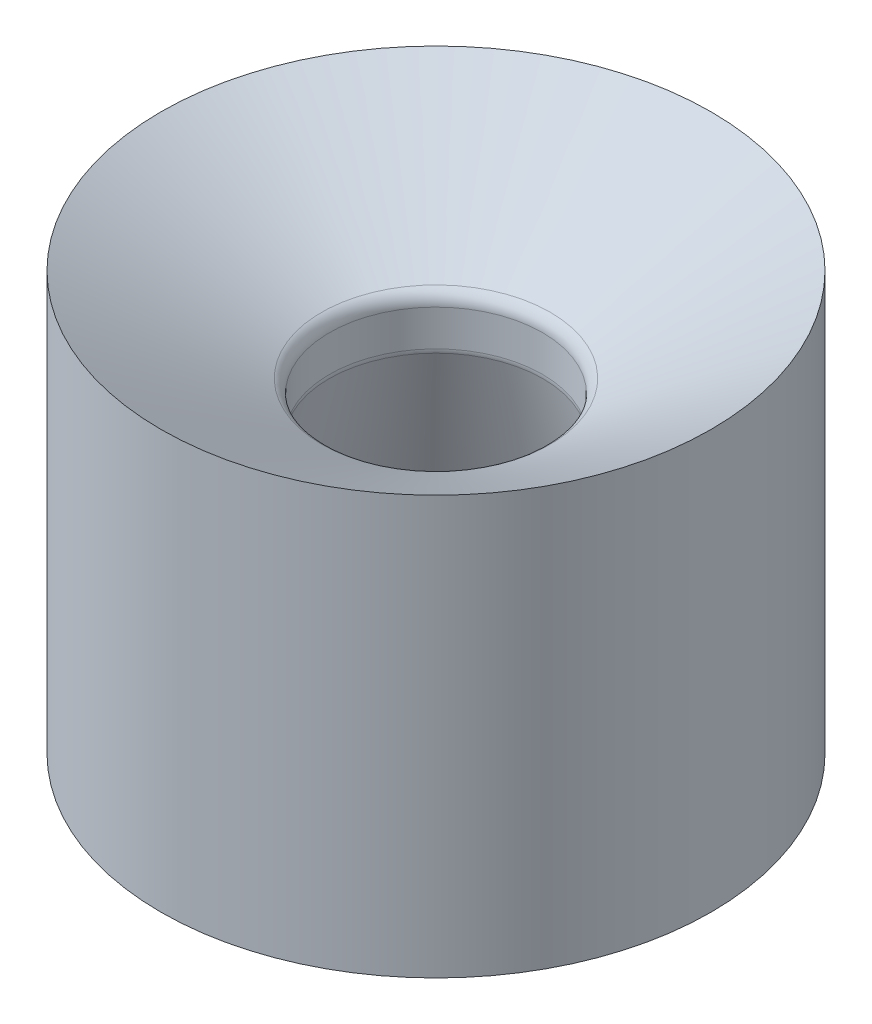
ISO-10303-21;
HEADER;
FILE_DESCRIPTION(('STEP AP214'),'2;1');
FILE_NAME('part.step','',(''),(''),'','','');
FILE_SCHEMA(('AUTOMOTIVE_DESIGN { 1 0 10303 214 1 1 1 1 }'));
ENDSEC;
DATA;
#1=APPLICATION_CONTEXT('core data for automotive mechanical design processes');
#2=APPLICATION_PROTOCOL_DEFINITION('international standard','automotive_design',2000,#1);
#3=PRODUCT_CONTEXT('',#1,'mechanical');
#4=PRODUCT('Part','Part','',(#3));
#5=PRODUCT_RELATED_PRODUCT_CATEGORY('part','',(#4));
#6=PRODUCT_DEFINITION_FORMATION('','',#4);
#7=PRODUCT_DEFINITION_CONTEXT('part definition',#1,'design');
#8=PRODUCT_DEFINITION('design','',#6,#7);
#9=PRODUCT_DEFINITION_SHAPE('','',#8);
#10=(LENGTH_UNIT() NAMED_UNIT(*) SI_UNIT(.MILLI.,.METRE.));
#11=(NAMED_UNIT(*) PLANE_ANGLE_UNIT() SI_UNIT($,.RADIAN.));
#12=(NAMED_UNIT(*) SI_UNIT($,.STERADIAN.) SOLID_ANGLE_UNIT());
#13=UNCERTAINTY_MEASURE_WITH_UNIT(LENGTH_MEASURE(1.E-05),#10,'distance_accuracy_value','');
#14=(GEOMETRIC_REPRESENTATION_CONTEXT(3) GLOBAL_UNCERTAINTY_ASSIGNED_CONTEXT((#13)) GLOBAL_UNIT_ASSIGNED_CONTEXT((#10,
#11,#12)) REPRESENTATION_CONTEXT('',''));
#15=CARTESIAN_POINT('',(0.,0.,0.));
#16=DIRECTION('',(0.,0.,1.));
#17=DIRECTION('',(1.,0.,0.));
#18=AXIS2_PLACEMENT_3D('',#15,#16,#17);
#19=CARTESIAN_POINT('',(0.,86.106,0.));
#20=DIRECTION('',(0.,-1.,0.));
#21=DIRECTION('',(0.,0.,-1.));
#22=AXIS2_PLACEMENT_3D('',#19,#20,#21);
#23=CYLINDRICAL_SURFACE('',#22,44.2849);
#24=CARTESIAN_POINT('',(0.,86.106,0.));
#25=DIRECTION('',(0.,1.,0.));
#26=DIRECTION('',(0.,0.,1.));
#27=AXIS2_PLACEMENT_3D('',#24,#25,#26);
#28=CIRCLE('',#27,44.2849);
#29=CARTESIAN_POINT('',(0.,86.106,44.2849));
#30=VERTEX_POINT('',#29);
#31=EDGE_CURVE('E63',#30,#30,#28,.T.);
#32=ORIENTED_EDGE('',*,*,#31,.F.);
#33=EDGE_LOOP('',(#32));
#34=FACE_BOUND('',#33,.T.);
#35=CARTESIAN_POINT('',(0.,18.796,0.));
#36=DIRECTION('',(0.,1.,0.));
#37=DIRECTION('',(0.,0.,1.));
#38=AXIS2_PLACEMENT_3D('',#35,#36,#37);
#39=CIRCLE('',#38,44.2849);
#40=CARTESIAN_POINT('',(0.,18.796,44.2849));
#41=VERTEX_POINT('',#40);
#42=EDGE_CURVE('E46',#41,#41,#39,.T.);
#43=ORIENTED_EDGE('',*,*,#42,.T.);
#44=EDGE_LOOP('',(#43));
#45=FACE_BOUND('',#44,.T.);
#46=ADVANCED_FACE('F42',(#34,#45),#23,.T.);
#47=CARTESIAN_POINT('',(0.,18.796,0.));
#48=DIRECTION('',(0.,1.,0.));
#49=DIRECTION('',(0.,0.,1.));
#50=AXIS2_PLACEMENT_3D('',#47,#48,#49);
#51=PLANE('',#50);
#52=CARTESIAN_POINT('',(0.,18.796,0.));
#53=DIRECTION('',(0.,1.,0.));
#54=DIRECTION('',(0.,0.,1.));
#55=AXIS2_PLACEMENT_3D('',#52,#53,#54);
#56=CIRCLE('',#55,28.9192234138084);
#57=CARTESIAN_POINT('',(0.,18.796,28.9192234138084));
#58=VERTEX_POINT('',#57);
#59=EDGE_CURVE('E60',#58,#58,#56,.T.);
#60=ORIENTED_EDGE('',*,*,#59,.T.);
#61=EDGE_LOOP('',(#60));
#62=FACE_BOUND('',#61,.T.);
#63=ORIENTED_EDGE('',*,*,#42,.F.);
#64=EDGE_LOOP('',(#63));
#65=FACE_BOUND('',#64,.T.);
#66=ADVANCED_FACE('F44',(#62,#65),#51,.F.);
#67=CARTESIAN_POINT('',(0.,70.358,0.));
#68=DIRECTION('',(0.,1.,0.));
#69=DIRECTION('',(0.,0.,1.));
#70=AXIS2_PLACEMENT_3D('',#67,#68,#69);
#71=CONICAL_SURFACE('',#70,17.145,1.04502347085495);
#72=CARTESIAN_POINT('',(0.,71.0921476985496,0.));
#73=DIRECTION('',(0.,-1.,0.));
#74=DIRECTION('',(0.,0.,-1.));
#75=AXIS2_PLACEMENT_3D('',#72,#73,#74);
#76=CIRCLE('',#75,18.4102206708067);
#77=CARTESIAN_POINT('',(0.,71.0921476985496,-18.4102206708067));
#78=VERTEX_POINT('',#77);
#79=EDGE_CURVE('E51',#78,#78,#76,.T.);
#80=ORIENTED_EDGE('',*,*,#79,.T.);
#81=EDGE_LOOP('',(#80));
#82=FACE_BOUND('',#81,.T.);
#83=ORIENTED_EDGE('',*,*,#31,.T.);
#84=EDGE_LOOP('',(#83));
#85=FACE_BOUND('',#84,.T.);
#86=ADVANCED_FACE('F103',(#82,#85),#71,.F.);
#87=CARTESIAN_POINT('',(0.,86.106,0.));
#88=DIRECTION('',(0.,1.,0.));
#89=DIRECTION('',(0.,0.,1.));
#90=AXIS2_PLACEMENT_3D('',#87,#88,#89);
#91=CYLINDRICAL_SURFACE('',#90,17.145);
#92=CARTESIAN_POINT('',(0.,68.8952094513834,0.));
#93=DIRECTION('',(0.,-1.,0.));
#94=DIRECTION('',(0.,0.,-1.));
#95=AXIS2_PLACEMENT_3D('',#92,#93,#94);
#96=CIRCLE('',#95,17.145);
#97=CARTESIAN_POINT('',(0.,68.8952094513834,-17.145));
#98=VERTEX_POINT('',#97);
#99=EDGE_CURVE('E57',#98,#98,#96,.F.);
#100=ORIENTED_EDGE('',*,*,#99,.T.);
#101=EDGE_LOOP('',(#100));
#102=FACE_BOUND('',#101,.T.);
#103=CARTESIAN_POINT('',(0.,63.072397343872,0.));
#104=DIRECTION('',(0.,-1.,0.));
#105=DIRECTION('',(0.,0.,-1.));
#106=AXIS2_PLACEMENT_3D('',#103,#104,#105);
#107=CIRCLE('',#106,17.145);
#108=CARTESIAN_POINT('',(0.,63.072397343872,-17.145));
#109=VERTEX_POINT('',#108);
#110=EDGE_CURVE('E69',#109,#109,#107,.T.);
#111=ORIENTED_EDGE('',*,*,#110,.T.);
#112=EDGE_LOOP('',(#111));
#113=FACE_BOUND('',#112,.T.);
#114=ADVANCED_FACE('F81',(#102,#113),#91,.F.);
#115=CARTESIAN_POINT('',(0.,0.,0.));
#116=DIRECTION('',(0.,-1.,0.));
#117=DIRECTION('',(0.,0.,-1.));
#118=AXIS2_PLACEMENT_3D('',#115,#116,#117);
#119=CONICAL_SURFACE('',#118,33.9555964347438,0.26179938779915);
#120=CARTESIAN_POINT('',(0.,62.4149969693116,0.));
#121=DIRECTION('',(0.,1.,0.));
#122=DIRECTION('',(0.,0.,1.));
#123=AXIS2_PLACEMENT_3D('',#120,#121,#122);
#124=CIRCLE('',#123,17.2315484012258);
#125=CARTESIAN_POINT('',(0.,62.4149969693116,17.2315484012258));
#126=VERTEX_POINT('',#125);
#127=EDGE_CURVE('E11',#126,#126,#124,.T.);
#128=ORIENTED_EDGE('',*,*,#127,.T.);
#129=EDGE_LOOP('',(#128));
#130=FACE_BOUND('',#129,.T.);
#131=ORIENTED_EDGE('',*,*,#59,.F.);
#132=EDGE_LOOP('',(#131));
#133=FACE_BOUND('',#132,.T.);
#134=ADVANCED_FACE('F87',(#130,#133),#119,.F.);
#135=CARTESIAN_POINT('',(0.,68.8952094513834,0.));
#136=DIRECTION('',(0.,-1.,0.));
#137=DIRECTION('',(0.,0.,-1.));
#138=AXIS2_PLACEMENT_3D('',#135,#136,#137);
#139=TOROIDAL_SURFACE('',#138,19.685,2.54);
#140=ORIENTED_EDGE('',*,*,#79,.F.);
#141=EDGE_LOOP('',(#140));
#142=FACE_BOUND('',#141,.T.);
#143=ORIENTED_EDGE('',*,*,#99,.F.);
#144=EDGE_LOOP('',(#143));
#145=FACE_BOUND('',#144,.T.);
#146=ADVANCED_FACE('F84',(#142,#145),#139,.T.);
#147=CARTESIAN_POINT('',(0.,63.072397343872,0.));
#148=DIRECTION('',(0.,-1.,0.));
#149=DIRECTION('',(0.,0.,-1.));
#150=AXIS2_PLACEMENT_3D('',#147,#148,#149);
#151=TOROIDAL_SURFACE('',#150,19.685,2.54);
#152=ORIENTED_EDGE('',*,*,#110,.F.);
#153=EDGE_LOOP('',(#152));
#154=FACE_BOUND('',#153,.T.);
#155=ORIENTED_EDGE('',*,*,#127,.F.);
#156=EDGE_LOOP('',(#155));
#157=FACE_BOUND('',#156,.T.);
#158=ADVANCED_FACE('F86',(#154,#157),#151,.T.);
#159=CLOSED_SHELL('',(#46,#66,#86,#114,#134,#146,#158));
#160=MANIFOLD_SOLID_BREP('B2',#159);
#161=ADVANCED_BREP_SHAPE_REPRESENTATION('',(#18,#160),#14);
#162=SHAPE_DEFINITION_REPRESENTATION(#9,#161);
ENDSEC;
END-ISO-10303-21;
